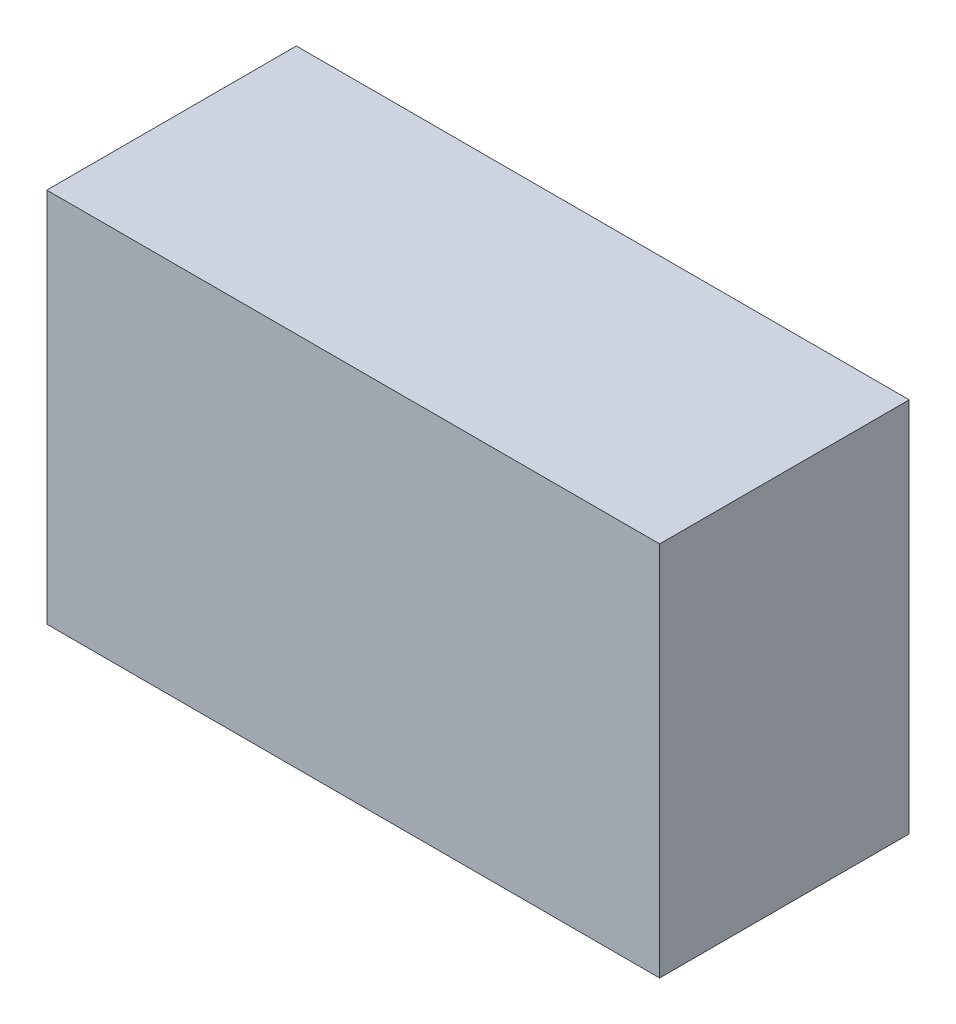
ISO-10303-21;
HEADER;
FILE_DESCRIPTION(('STEP AP214'),'2;1');
FILE_NAME('part.step','',(''),(''),'','','');
FILE_SCHEMA(('AUTOMOTIVE_DESIGN { 1 0 10303 214 1 1 1 1 }'));
ENDSEC;
DATA;
#1=APPLICATION_CONTEXT('core data for automotive mechanical design processes');
#2=APPLICATION_PROTOCOL_DEFINITION('international standard','automotive_design',2000,#1);
#3=PRODUCT_CONTEXT('',#1,'mechanical');
#4=PRODUCT('Part','Part','',(#3));
#5=PRODUCT_RELATED_PRODUCT_CATEGORY('part','',(#4));
#6=PRODUCT_DEFINITION_FORMATION('','',#4);
#7=PRODUCT_DEFINITION_CONTEXT('part definition',#1,'design');
#8=PRODUCT_DEFINITION('design','',#6,#7);
#9=PRODUCT_DEFINITION_SHAPE('','',#8);
#10=(LENGTH_UNIT() NAMED_UNIT(*) SI_UNIT(.MILLI.,.METRE.));
#11=(NAMED_UNIT(*) PLANE_ANGLE_UNIT() SI_UNIT($,.RADIAN.));
#12=(NAMED_UNIT(*) SI_UNIT($,.STERADIAN.) SOLID_ANGLE_UNIT());
#13=UNCERTAINTY_MEASURE_WITH_UNIT(LENGTH_MEASURE(1.E-05),#10,'distance_accuracy_value','');
#14=(GEOMETRIC_REPRESENTATION_CONTEXT(3) GLOBAL_UNCERTAINTY_ASSIGNED_CONTEXT((#13)) GLOBAL_UNIT_ASSIGNED_CONTEXT((#10,
#11,#12)) REPRESENTATION_CONTEXT('',''));
#15=CARTESIAN_POINT('',(0.,0.,0.));
#16=DIRECTION('',(0.,0.,1.));
#17=DIRECTION('',(1.,0.,0.));
#18=AXIS2_PLACEMENT_3D('',#15,#16,#17);
#19=CARTESIAN_POINT('',(-0.97,0.595,0.));
#20=DIRECTION('',(0.,0.,1.));
#21=DIRECTION('',(1.,0.,0.));
#22=AXIS2_PLACEMENT_3D('',#19,#20,#21);
#23=PLANE('',#22);
#24=DIRECTION('',(0.,1.,0.));
#25=VECTOR('',#24,1.);
#26=CARTESIAN_POINT('',(0.97,0.595,0.));
#27=LINE('',#26,#25);
#28=CARTESIAN_POINT('',(0.97,-0.595,0.));
#29=VERTEX_POINT('',#28);
#30=CARTESIAN_POINT('',(0.97,0.595,0.));
#31=VERTEX_POINT('',#30);
#32=EDGE_CURVE('E96',#29,#31,#27,.T.);
#33=ORIENTED_EDGE('',*,*,#32,.F.);
#34=DIRECTION('',(1.,0.,0.));
#35=VECTOR('',#34,1.);
#36=CARTESIAN_POINT('',(-0.97,-0.595,0.));
#37=LINE('',#36,#35);
#38=CARTESIAN_POINT('',(-0.97,-0.595,0.));
#39=VERTEX_POINT('',#38);
#40=EDGE_CURVE('E42',#39,#29,#37,.T.);
#41=ORIENTED_EDGE('',*,*,#40,.F.);
#42=DIRECTION('',(0.,-1.,0.));
#43=VECTOR('',#42,1.);
#44=CARTESIAN_POINT('',(-0.97,0.595,0.));
#45=LINE('',#44,#43);
#46=CARTESIAN_POINT('',(-0.97,0.595,0.));
#47=VERTEX_POINT('',#46);
#48=EDGE_CURVE('E69',#47,#39,#45,.T.);
#49=ORIENTED_EDGE('',*,*,#48,.F.);
#50=DIRECTION('',(-1.,0.,0.));
#51=VECTOR('',#50,1.);
#52=CARTESIAN_POINT('',(-0.97,0.595,0.));
#53=LINE('',#52,#51);
#54=EDGE_CURVE('E28',#31,#47,#53,.T.);
#55=ORIENTED_EDGE('',*,*,#54,.F.);
#56=EDGE_LOOP('',(#33,#41,#49,#55));
#57=FACE_BOUND('',#56,.T.);
#58=ADVANCED_FACE('F17',(#57),#23,.F.);
#59=CARTESIAN_POINT('',(-0.97,0.595,0.));
#60=DIRECTION('',(0.,1.,0.));
#61=DIRECTION('',(1.,0.,0.));
#62=AXIS2_PLACEMENT_3D('',#59,#60,#61);
#63=PLANE('',#62);
#64=DIRECTION('',(0.,0.,-1.));
#65=VECTOR('',#64,1.);
#66=CARTESIAN_POINT('',(0.97,0.595,0.));
#67=LINE('',#66,#65);
#68=CARTESIAN_POINT('',(0.97,0.595,0.79));
#69=VERTEX_POINT('',#68);
#70=EDGE_CURVE('E11',#69,#31,#67,.T.);
#71=ORIENTED_EDGE('',*,*,#70,.T.);
#72=ORIENTED_EDGE('',*,*,#54,.T.);
#73=DIRECTION('',(0.,0.,1.));
#74=VECTOR('',#73,1.);
#75=CARTESIAN_POINT('',(-0.97,0.595,0.));
#76=LINE('',#75,#74);
#77=CARTESIAN_POINT('',(-0.97,0.595,0.79));
#78=VERTEX_POINT('',#77);
#79=EDGE_CURVE('E93',#47,#78,#76,.T.);
#80=ORIENTED_EDGE('',*,*,#79,.T.);
#81=DIRECTION('',(1.,0.,0.));
#82=VECTOR('',#81,1.);
#83=CARTESIAN_POINT('',(-0.97,0.595,0.79));
#84=LINE('',#83,#82);
#85=EDGE_CURVE('E82',#78,#69,#84,.T.);
#86=ORIENTED_EDGE('',*,*,#85,.T.);
#87=EDGE_LOOP('',(#71,#72,#80,#86));
#88=FACE_BOUND('',#87,.T.);
#89=ADVANCED_FACE('F111',(#88),#63,.T.);
#90=CARTESIAN_POINT('',(0.97,0.595,0.));
#91=DIRECTION('',(1.,0.,0.));
#92=DIRECTION('',(0.,1.,0.));
#93=AXIS2_PLACEMENT_3D('',#90,#91,#92);
#94=PLANE('',#93);
#95=DIRECTION('',(0.,0.,-1.));
#96=VECTOR('',#95,1.);
#97=CARTESIAN_POINT('',(0.97,-0.595,0.));
#98=LINE('',#97,#96);
#99=CARTESIAN_POINT('',(0.97,-0.595,0.79));
#100=VERTEX_POINT('',#99);
#101=EDGE_CURVE('E64',#100,#29,#98,.T.);
#102=ORIENTED_EDGE('',*,*,#101,.T.);
#103=ORIENTED_EDGE('',*,*,#32,.T.);
#104=ORIENTED_EDGE('',*,*,#70,.F.);
#105=DIRECTION('',(0.,-1.,0.));
#106=VECTOR('',#105,1.);
#107=CARTESIAN_POINT('',(0.97,0.595,0.79));
#108=LINE('',#107,#106);
#109=EDGE_CURVE('E77',#69,#100,#108,.T.);
#110=ORIENTED_EDGE('',*,*,#109,.T.);
#111=EDGE_LOOP('',(#102,#103,#104,#110));
#112=FACE_BOUND('',#111,.T.);
#113=ADVANCED_FACE('F19',(#112),#94,.T.);
#114=CARTESIAN_POINT('',(0.97,-0.595,0.));
#115=DIRECTION('',(0.,-1.,0.));
#116=DIRECTION('',(0.,0.,-1.));
#117=AXIS2_PLACEMENT_3D('',#114,#115,#116);
#118=PLANE('',#117);
#119=DIRECTION('',(0.,0.,-1.));
#120=VECTOR('',#119,1.);
#121=CARTESIAN_POINT('',(-0.97,-0.595,0.));
#122=LINE('',#121,#120);
#123=CARTESIAN_POINT('',(-0.97,-0.595,0.79));
#124=VERTEX_POINT('',#123);
#125=EDGE_CURVE('E62',#124,#39,#122,.T.);
#126=ORIENTED_EDGE('',*,*,#125,.T.);
#127=ORIENTED_EDGE('',*,*,#40,.T.);
#128=ORIENTED_EDGE('',*,*,#101,.F.);
#129=DIRECTION('',(-1.,0.,0.));
#130=VECTOR('',#129,1.);
#131=CARTESIAN_POINT('',(0.97,-0.595,0.79));
#132=LINE('',#131,#130);
#133=EDGE_CURVE('E59',#100,#124,#132,.T.);
#134=ORIENTED_EDGE('',*,*,#133,.T.);
#135=EDGE_LOOP('',(#126,#127,#128,#134));
#136=FACE_BOUND('',#135,.T.);
#137=ADVANCED_FACE('F61',(#136),#118,.T.);
#138=CARTESIAN_POINT('',(-0.97,-0.595,0.));
#139=DIRECTION('',(-1.,0.,0.));
#140=DIRECTION('',(0.,0.,1.));
#141=AXIS2_PLACEMENT_3D('',#138,#139,#140);
#142=PLANE('',#141);
#143=ORIENTED_EDGE('',*,*,#79,.F.);
#144=ORIENTED_EDGE('',*,*,#48,.T.);
#145=ORIENTED_EDGE('',*,*,#125,.F.);
#146=DIRECTION('',(0.,1.,0.));
#147=VECTOR('',#146,1.);
#148=CARTESIAN_POINT('',(-0.97,-0.595,0.79));
#149=LINE('',#148,#147);
#150=EDGE_CURVE('E21',#124,#78,#149,.T.);
#151=ORIENTED_EDGE('',*,*,#150,.T.);
#152=EDGE_LOOP('',(#143,#144,#145,#151));
#153=FACE_BOUND('',#152,.T.);
#154=ADVANCED_FACE('F73',(#153),#142,.T.);
#155=CARTESIAN_POINT('',(-0.97,0.595,0.79));
#156=DIRECTION('',(0.,0.,1.));
#157=DIRECTION('',(1.,0.,0.));
#158=AXIS2_PLACEMENT_3D('',#155,#156,#157);
#159=PLANE('',#158);
#160=ORIENTED_EDGE('',*,*,#109,.F.);
#161=ORIENTED_EDGE('',*,*,#85,.F.);
#162=ORIENTED_EDGE('',*,*,#150,.F.);
#163=ORIENTED_EDGE('',*,*,#133,.F.);
#164=EDGE_LOOP('',(#160,#161,#162,#163));
#165=FACE_BOUND('',#164,.T.);
#166=ADVANCED_FACE('F80',(#165),#159,.T.);
#167=CLOSED_SHELL('',(#58,#89,#113,#137,#154,#166));
#168=MANIFOLD_SOLID_BREP('B1',#167);
#169=ADVANCED_BREP_SHAPE_REPRESENTATION('',(#18,#168),#14);
#170=SHAPE_DEFINITION_REPRESENTATION(#9,#169);
ENDSEC;
END-ISO-10303-21;
